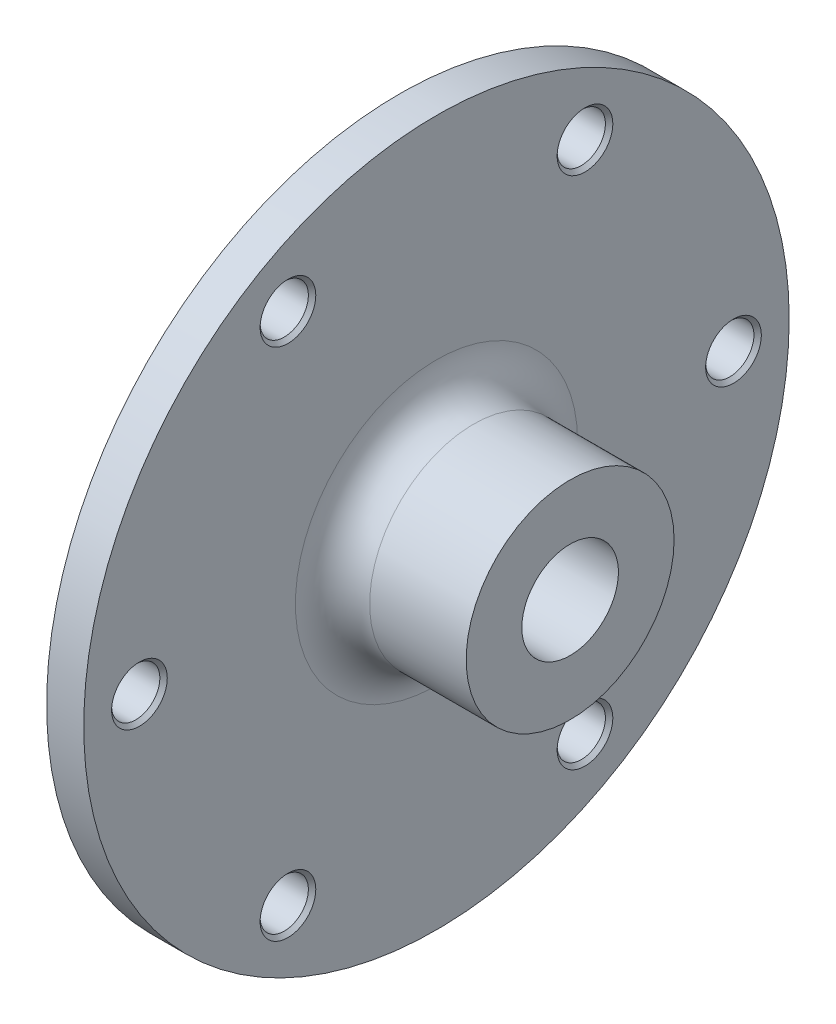
ISO-10303-21;
HEADER;
FILE_DESCRIPTION(('STEP AP214'),'2;1');
FILE_NAME('part.step','',(''),(''),'','','');
FILE_SCHEMA(('AUTOMOTIVE_DESIGN { 1 0 10303 214 1 1 1 1 }'));
ENDSEC;
DATA;
#1=APPLICATION_CONTEXT('core data for automotive mechanical design processes');
#2=APPLICATION_PROTOCOL_DEFINITION('international standard','automotive_design',2000,#1);
#3=PRODUCT_CONTEXT('',#1,'mechanical');
#4=PRODUCT('Part','Part','',(#3));
#5=PRODUCT_RELATED_PRODUCT_CATEGORY('part','',(#4));
#6=PRODUCT_DEFINITION_FORMATION('','',#4);
#7=PRODUCT_DEFINITION_CONTEXT('part definition',#1,'design');
#8=PRODUCT_DEFINITION('design','',#6,#7);
#9=PRODUCT_DEFINITION_SHAPE('','',#8);
#10=(LENGTH_UNIT() NAMED_UNIT(*) SI_UNIT(.MILLI.,.METRE.));
#11=(NAMED_UNIT(*) PLANE_ANGLE_UNIT() SI_UNIT($,.RADIAN.));
#12=(NAMED_UNIT(*) SI_UNIT($,.STERADIAN.) SOLID_ANGLE_UNIT());
#13=UNCERTAINTY_MEASURE_WITH_UNIT(LENGTH_MEASURE(1.E-05),#10,'distance_accuracy_value','');
#14=(GEOMETRIC_REPRESENTATION_CONTEXT(3) GLOBAL_UNCERTAINTY_ASSIGNED_CONTEXT((#13)) GLOBAL_UNIT_ASSIGNED_CONTEXT((#10,
#11,#12)) REPRESENTATION_CONTEXT('',''));
#15=CARTESIAN_POINT('',(0.,0.,0.));
#16=DIRECTION('',(0.,0.,1.));
#17=DIRECTION('',(1.,0.,0.));
#18=AXIS2_PLACEMENT_3D('',#15,#16,#17);
#19=CARTESIAN_POINT('',(0.,14.,0.));
#20=DIRECTION('',(1.,0.,0.));
#21=DIRECTION('',(0.,0.,-1.));
#22=AXIS2_PLACEMENT_3D('',#19,#20,#21);
#23=PLANE('',#22);
#24=CARTESIAN_POINT('',(0.,0.,0.));
#25=DIRECTION('',(-1.,0.,0.));
#26=DIRECTION('',(0.,0.,1.));
#27=AXIS2_PLACEMENT_3D('',#24,#25,#26);
#28=CIRCLE('',#27,6.49999999999999);
#29=CARTESIAN_POINT('',(0.,0.,6.49999999999999));
#30=VERTEX_POINT('',#29);
#31=EDGE_CURVE('E102',#30,#30,#28,.T.);
#32=ORIENTED_EDGE('',*,*,#31,.T.);
#33=EDGE_LOOP('',(#32));
#34=FACE_BOUND('',#33,.T.);
#35=CARTESIAN_POINT('',(0.,0.,0.));
#36=DIRECTION('',(1.,0.,0.));
#37=DIRECTION('',(0.,0.,-1.));
#38=AXIS2_PLACEMENT_3D('',#35,#36,#37);
#39=CIRCLE('',#38,14.);
#40=CARTESIAN_POINT('',(0.,0.,-14.));
#41=VERTEX_POINT('',#40);
#42=EDGE_CURVE('E105',#41,#41,#39,.T.);
#43=ORIENTED_EDGE('',*,*,#42,.T.);
#44=EDGE_LOOP('',(#43));
#45=FACE_BOUND('',#44,.T.);
#46=ADVANCED_FACE('F30',(#34,#45),#23,.T.);
#47=CARTESIAN_POINT('',(-28.,0.,0.));
#48=DIRECTION('',(-1.,0.,0.));
#49=DIRECTION('',(0.,0.,1.));
#50=AXIS2_PLACEMENT_3D('',#47,#48,#49);
#51=PLANE('',#50);
#52=CARTESIAN_POINT('',(-28.,0.,0.));
#53=DIRECTION('',(-1.,0.,0.));
#54=DIRECTION('',(0.,0.,1.));
#55=AXIS2_PLACEMENT_3D('',#52,#53,#54);
#56=CIRCLE('',#55,13.);
#57=CARTESIAN_POINT('',(-28.,0.,13.));
#58=VERTEX_POINT('',#57);
#59=EDGE_CURVE('E50',#58,#58,#56,.T.);
#60=ORIENTED_EDGE('',*,*,#59,.F.);
#61=EDGE_LOOP('',(#60));
#62=FACE_BOUND('',#61,.T.);
#63=CARTESIAN_POINT('',(-28.,0.,0.));
#64=DIRECTION('',(1.,0.,0.));
#65=DIRECTION('',(0.,0.,-1.));
#66=AXIS2_PLACEMENT_3D('',#63,#64,#65);
#67=CIRCLE('',#66,35.);
#68=CARTESIAN_POINT('',(-28.,0.,-35.));
#69=VERTEX_POINT('',#68);
#70=EDGE_CURVE('E43',#69,#69,#67,.T.);
#71=ORIENTED_EDGE('',*,*,#70,.F.);
#72=EDGE_LOOP('',(#71));
#73=FACE_BOUND('',#72,.T.);
#74=ADVANCED_FACE('F122',(#62,#73),#51,.T.);
#75=CARTESIAN_POINT('',(0.,0.,0.));
#76=DIRECTION('',(1.,0.,0.));
#77=DIRECTION('',(0.,0.,-1.));
#78=AXIS2_PLACEMENT_3D('',#75,#76,#77);
#79=CYLINDRICAL_SURFACE('',#78,35.);
#80=ORIENTED_EDGE('',*,*,#70,.T.);
#81=EDGE_LOOP('',(#80));
#82=FACE_BOUND('',#81,.T.);
#83=CARTESIAN_POINT('',(-23.,0.,0.));
#84=DIRECTION('',(1.,0.,0.));
#85=DIRECTION('',(0.,0.,-1.));
#86=AXIS2_PLACEMENT_3D('',#83,#84,#85);
#87=CIRCLE('',#86,35.);
#88=CARTESIAN_POINT('',(-23.,0.,-35.));
#89=VERTEX_POINT('',#88);
#90=EDGE_CURVE('E114',#89,#89,#87,.T.);
#91=ORIENTED_EDGE('',*,*,#90,.F.);
#92=EDGE_LOOP('',(#91));
#93=FACE_BOUND('',#92,.T.);
#94=ADVANCED_FACE('F119',(#82,#93),#79,.T.);
#95=CARTESIAN_POINT('',(-23.,35.,0.));
#96=DIRECTION('',(-1.,0.,0.));
#97=DIRECTION('',(0.,0.,1.));
#98=AXIS2_PLACEMENT_3D('',#95,#96,#97);
#99=PLANE('',#98);
#100=CARTESIAN_POINT('',(-23.,34.6410161513773,20.0000000000004));
#101=DIRECTION('',(-1.,0.,0.));
#102=DIRECTION('',(0.,0.,1.));
#103=AXIS2_PLACEMENT_3D('',#100,#101,#102);
#104=CIRCLE('',#103,3.25);
#105=CARTESIAN_POINT('',(-23.,34.6410161513773,23.2500000000004));
#106=VERTEX_POINT('',#105);
#107=EDGE_CURVE('E34',#106,#106,#104,.T.);
#108=ORIENTED_EDGE('',*,*,#107,.F.);
#109=EDGE_LOOP('',(#108));
#110=FACE_BOUND('',#109,.T.);
#111=CARTESIAN_POINT('',(-23.,34.6410161513777,-19.9999999999997));
#112=DIRECTION('',(-1.,0.,0.));
#113=DIRECTION('',(0.,0.,1.));
#114=AXIS2_PLACEMENT_3D('',#111,#112,#113);
#115=CIRCLE('',#114,3.25);
#116=CARTESIAN_POINT('',(-23.,34.6410161513777,-16.7499999999997));
#117=VERTEX_POINT('',#116);
#118=EDGE_CURVE('E66',#117,#117,#115,.T.);
#119=ORIENTED_EDGE('',*,*,#118,.F.);
#120=EDGE_LOOP('',(#119));
#121=FACE_BOUND('',#120,.T.);
#122=CARTESIAN_POINT('',(-23.,0.,-40.));
#123=DIRECTION('',(-1.,0.,0.));
#124=DIRECTION('',(0.,0.,1.));
#125=AXIS2_PLACEMENT_3D('',#122,#123,#124);
#126=CIRCLE('',#125,3.25);
#127=CARTESIAN_POINT('',(-23.,0.,-36.75));
#128=VERTEX_POINT('',#127);
#129=EDGE_CURVE('E62',#128,#128,#126,.T.);
#130=ORIENTED_EDGE('',*,*,#129,.F.);
#131=EDGE_LOOP('',(#130));
#132=FACE_BOUND('',#131,.T.);
#133=CARTESIAN_POINT('',(-23.,-34.6410161513775,-20.0000000000002));
#134=DIRECTION('',(-1.,0.,0.));
#135=DIRECTION('',(0.,0.,1.));
#136=AXIS2_PLACEMENT_3D('',#133,#134,#135);
#137=CIRCLE('',#136,3.25);
#138=CARTESIAN_POINT('',(-23.,-34.6410161513775,-16.7500000000002));
#139=VERTEX_POINT('',#138);
#140=EDGE_CURVE('E57',#139,#139,#137,.T.);
#141=ORIENTED_EDGE('',*,*,#140,.F.);
#142=EDGE_LOOP('',(#141));
#143=FACE_BOUND('',#142,.T.);
#144=CARTESIAN_POINT('',(-23.,-34.6410161513776,19.9999999999999));
#145=DIRECTION('',(-1.,0.,0.));
#146=DIRECTION('',(0.,0.,1.));
#147=AXIS2_PLACEMENT_3D('',#144,#145,#146);
#148=CIRCLE('',#147,3.25);
#149=CARTESIAN_POINT('',(-23.,-34.6410161513776,23.2499999999999));
#150=VERTEX_POINT('',#149);
#151=EDGE_CURVE('E52',#150,#150,#148,.T.);
#152=ORIENTED_EDGE('',*,*,#151,.F.);
#153=EDGE_LOOP('',(#152));
#154=FACE_BOUND('',#153,.T.);
#155=CARTESIAN_POINT('',(-23.,0.,40.));
#156=DIRECTION('',(-1.,0.,0.));
#157=DIRECTION('',(0.,0.,1.));
#158=AXIS2_PLACEMENT_3D('',#155,#156,#157);
#159=CIRCLE('',#158,3.25);
#160=CARTESIAN_POINT('',(-23.,0.,43.25));
#161=VERTEX_POINT('',#160);
#162=EDGE_CURVE('E47',#161,#161,#159,.T.);
#163=ORIENTED_EDGE('',*,*,#162,.F.);
#164=EDGE_LOOP('',(#163));
#165=FACE_BOUND('',#164,.T.);
#166=ORIENTED_EDGE('',*,*,#90,.T.);
#167=EDGE_LOOP('',(#166));
#168=FACE_BOUND('',#167,.T.);
#169=CARTESIAN_POINT('',(-23.,0.,0.));
#170=DIRECTION('',(1.,0.,0.));
#171=DIRECTION('',(0.,0.,-1.));
#172=AXIS2_PLACEMENT_3D('',#169,#170,#171);
#173=CIRCLE('',#172,47.5);
#174=CARTESIAN_POINT('',(-23.,0.,-47.5));
#175=VERTEX_POINT('',#174);
#176=EDGE_CURVE('E111',#175,#175,#173,.T.);
#177=ORIENTED_EDGE('',*,*,#176,.F.);
#178=EDGE_LOOP('',(#177));
#179=FACE_BOUND('',#178,.T.);
#180=ADVANCED_FACE('F130',(#110,#121,#132,#143,#154,#165,#168,#179),#99,.T.);
#181=CARTESIAN_POINT('',(0.,0.,0.));
#182=DIRECTION('',(1.,0.,0.));
#183=DIRECTION('',(0.,0.,-1.));
#184=AXIS2_PLACEMENT_3D('',#181,#182,#183);
#185=CYLINDRICAL_SURFACE('',#184,47.5);
#186=ORIENTED_EDGE('',*,*,#176,.T.);
#187=EDGE_LOOP('',(#186));
#188=FACE_BOUND('',#187,.T.);
#189=CARTESIAN_POINT('',(-18.,0.,0.));
#190=DIRECTION('',(1.,0.,0.));
#191=DIRECTION('',(0.,0.,-1.));
#192=AXIS2_PLACEMENT_3D('',#189,#190,#191);
#193=CIRCLE('',#192,47.5);
#194=CARTESIAN_POINT('',(-18.,0.,-47.5));
#195=VERTEX_POINT('',#194);
#196=EDGE_CURVE('E108',#195,#195,#193,.T.);
#197=ORIENTED_EDGE('',*,*,#196,.F.);
#198=EDGE_LOOP('',(#197));
#199=FACE_BOUND('',#198,.T.);
#200=ADVANCED_FACE('F137',(#188,#199),#185,.T.);
#201=CARTESIAN_POINT('',(-18.,47.5,0.));
#202=DIRECTION('',(1.,0.,0.));
#203=DIRECTION('',(0.,0.,-1.));
#204=AXIS2_PLACEMENT_3D('',#201,#202,#203);
#205=PLANE('',#204);
#206=CARTESIAN_POINT('',(-18.,34.6410161513773,20.0000000000004));
#207=DIRECTION('',(1.,0.,0.));
#208=DIRECTION('',(0.,0.,-1.));
#209=AXIS2_PLACEMENT_3D('',#206,#207,#208);
#210=CIRCLE('',#209,3.75);
#211=CARTESIAN_POINT('',(-18.,34.6410161513773,16.2500000000004));
#212=VERTEX_POINT('',#211);
#213=EDGE_CURVE('E212',#212,#212,#210,.T.);
#214=ORIENTED_EDGE('',*,*,#213,.F.);
#215=EDGE_LOOP('',(#214));
#216=FACE_BOUND('',#215,.T.);
#217=CARTESIAN_POINT('',(-18.,34.6410161513777,-19.9999999999997));
#218=DIRECTION('',(1.,0.,0.));
#219=DIRECTION('',(0.,0.,-1.));
#220=AXIS2_PLACEMENT_3D('',#217,#218,#219);
#221=CIRCLE('',#220,3.75);
#222=CARTESIAN_POINT('',(-18.,34.6410161513777,-23.7499999999997));
#223=VERTEX_POINT('',#222);
#224=EDGE_CURVE('E75',#223,#223,#221,.T.);
#225=ORIENTED_EDGE('',*,*,#224,.F.);
#226=EDGE_LOOP('',(#225));
#227=FACE_BOUND('',#226,.T.);
#228=CARTESIAN_POINT('',(-18.,0.,-40.));
#229=DIRECTION('',(1.,0.,0.));
#230=DIRECTION('',(0.,0.,-1.));
#231=AXIS2_PLACEMENT_3D('',#228,#229,#230);
#232=CIRCLE('',#231,3.75);
#233=CARTESIAN_POINT('',(-18.,0.,-43.75));
#234=VERTEX_POINT('',#233);
#235=EDGE_CURVE('E68',#234,#234,#232,.T.);
#236=ORIENTED_EDGE('',*,*,#235,.F.);
#237=EDGE_LOOP('',(#236));
#238=FACE_BOUND('',#237,.T.);
#239=CARTESIAN_POINT('',(-18.,-34.6410161513775,-20.0000000000002));
#240=DIRECTION('',(1.,0.,0.));
#241=DIRECTION('',(0.,0.,-1.));
#242=AXIS2_PLACEMENT_3D('',#239,#240,#241);
#243=CIRCLE('',#242,3.75);
#244=CARTESIAN_POINT('',(-18.,-34.6410161513775,-23.7500000000002));
#245=VERTEX_POINT('',#244);
#246=EDGE_CURVE('E64',#245,#245,#243,.T.);
#247=ORIENTED_EDGE('',*,*,#246,.F.);
#248=EDGE_LOOP('',(#247));
#249=FACE_BOUND('',#248,.T.);
#250=CARTESIAN_POINT('',(-18.,-34.6410161513776,19.9999999999999));
#251=DIRECTION('',(1.,0.,0.));
#252=DIRECTION('',(0.,0.,-1.));
#253=AXIS2_PLACEMENT_3D('',#250,#251,#252);
#254=CIRCLE('',#253,3.75);
#255=CARTESIAN_POINT('',(-18.,-34.6410161513776,16.2499999999999));
#256=VERTEX_POINT('',#255);
#257=EDGE_CURVE('E60',#256,#256,#254,.T.);
#258=ORIENTED_EDGE('',*,*,#257,.F.);
#259=EDGE_LOOP('',(#258));
#260=FACE_BOUND('',#259,.T.);
#261=CARTESIAN_POINT('',(-18.,0.,40.));
#262=DIRECTION('',(1.,0.,0.));
#263=DIRECTION('',(0.,0.,-1.));
#264=AXIS2_PLACEMENT_3D('',#261,#262,#263);
#265=CIRCLE('',#264,3.75);
#266=CARTESIAN_POINT('',(-18.,0.,36.25));
#267=VERTEX_POINT('',#266);
#268=EDGE_CURVE('E55',#267,#267,#265,.T.);
#269=ORIENTED_EDGE('',*,*,#268,.F.);
#270=EDGE_LOOP('',(#269));
#271=FACE_BOUND('',#270,.T.);
#272=CARTESIAN_POINT('',(-18.,0.,0.));
#273=DIRECTION('',(1.,0.,0.));
#274=DIRECTION('',(0.,0.,-1.));
#275=AXIS2_PLACEMENT_3D('',#272,#273,#274);
#276=CIRCLE('',#275,19.);
#277=CARTESIAN_POINT('',(-18.,0.,-19.));
#278=VERTEX_POINT('',#277);
#279=EDGE_CURVE('E10',#278,#278,#276,.F.);
#280=ORIENTED_EDGE('',*,*,#279,.T.);
#281=EDGE_LOOP('',(#280));
#282=FACE_BOUND('',#281,.T.);
#283=ORIENTED_EDGE('',*,*,#196,.T.);
#284=EDGE_LOOP('',(#283));
#285=FACE_BOUND('',#284,.T.);
#286=ADVANCED_FACE('F141',(#216,#227,#238,#249,#260,#271,#282,#285),#205,.T.);
#287=CARTESIAN_POINT('',(0.,0.,0.));
#288=DIRECTION('',(1.,0.,0.));
#289=DIRECTION('',(0.,0.,-1.));
#290=AXIS2_PLACEMENT_3D('',#287,#288,#289);
#291=CYLINDRICAL_SURFACE('',#290,14.);
#292=CARTESIAN_POINT('',(-13.,0.,0.));
#293=DIRECTION('',(1.,0.,0.));
#294=DIRECTION('',(0.,0.,-1.));
#295=AXIS2_PLACEMENT_3D('',#292,#293,#294);
#296=CIRCLE('',#295,14.);
#297=CARTESIAN_POINT('',(-13.,0.,-14.));
#298=VERTEX_POINT('',#297);
#299=EDGE_CURVE('E38',#298,#298,#296,.T.);
#300=ORIENTED_EDGE('',*,*,#299,.T.);
#301=EDGE_LOOP('',(#300));
#302=FACE_BOUND('',#301,.T.);
#303=ORIENTED_EDGE('',*,*,#42,.F.);
#304=EDGE_LOOP('',(#303));
#305=FACE_BOUND('',#304,.T.);
#306=ADVANCED_FACE('F145',(#302,#305),#291,.T.);
#307=CARTESIAN_POINT('',(-13.,0.,0.));
#308=DIRECTION('',(1.,0.,0.));
#309=DIRECTION('',(0.,0.,-1.));
#310=AXIS2_PLACEMENT_3D('',#307,#308,#309);
#311=TOROIDAL_SURFACE('',#310,19.,5.);
#312=ORIENTED_EDGE('',*,*,#279,.F.);
#313=EDGE_LOOP('',(#312));
#314=FACE_BOUND('',#313,.T.);
#315=ORIENTED_EDGE('',*,*,#299,.F.);
#316=EDGE_LOOP('',(#315));
#317=FACE_BOUND('',#316,.T.);
#318=ADVANCED_FACE('F32',(#314,#317),#311,.F.);
#319=CARTESIAN_POINT('',(-28.,0.,0.));
#320=DIRECTION('',(-1.,0.,0.));
#321=DIRECTION('',(0.,0.,1.));
#322=AXIS2_PLACEMENT_3D('',#319,#320,#321);
#323=CYLINDRICAL_SURFACE('',#322,6.49999999999999);
#324=ORIENTED_EDGE('',*,*,#31,.F.);
#325=EDGE_LOOP('',(#324));
#326=FACE_BOUND('',#325,.T.);
#327=CARTESIAN_POINT('',(-21.5,0.,0.));
#328=DIRECTION('',(-1.,0.,0.));
#329=DIRECTION('',(0.,0.,1.));
#330=AXIS2_PLACEMENT_3D('',#327,#328,#329);
#331=CIRCLE('',#330,6.49999999999999);
#332=CARTESIAN_POINT('',(-21.5,0.,6.49999999999999));
#333=VERTEX_POINT('',#332);
#334=EDGE_CURVE('E99',#333,#333,#331,.T.);
#335=ORIENTED_EDGE('',*,*,#334,.T.);
#336=EDGE_LOOP('',(#335));
#337=FACE_BOUND('',#336,.T.);
#338=ADVANCED_FACE('F150',(#326,#337),#323,.F.);
#339=CARTESIAN_POINT('',(-28.,0.,0.));
#340=DIRECTION('',(-1.,0.,0.));
#341=DIRECTION('',(0.,0.,1.));
#342=AXIS2_PLACEMENT_3D('',#339,#340,#341);
#343=CONICAL_SURFACE('',#342,13.,0.785398163397449);
#344=ORIENTED_EDGE('',*,*,#334,.F.);
#345=EDGE_LOOP('',(#344));
#346=FACE_BOUND('',#345,.T.);
#347=ORIENTED_EDGE('',*,*,#59,.T.);
#348=EDGE_LOOP('',(#347));
#349=FACE_BOUND('',#348,.T.);
#350=ADVANCED_FACE('F153',(#346,#349),#343,.F.);
#351=CARTESIAN_POINT('',(-18.,0.,40.));
#352=DIRECTION('',(1.,0.,0.));
#353=DIRECTION('',(0.,0.,-1.));
#354=AXIS2_PLACEMENT_3D('',#351,#352,#353);
#355=CYLINDRICAL_SURFACE('',#354,3.25);
#356=ORIENTED_EDGE('',*,*,#162,.T.);
#357=EDGE_LOOP('',(#356));
#358=FACE_BOUND('',#357,.T.);
#359=CARTESIAN_POINT('',(-18.5,0.,40.));
#360=DIRECTION('',(1.,0.,0.));
#361=DIRECTION('',(0.,0.,-1.));
#362=AXIS2_PLACEMENT_3D('',#359,#360,#361);
#363=CIRCLE('',#362,3.25);
#364=CARTESIAN_POINT('',(-18.5,0.,36.75));
#365=VERTEX_POINT('',#364);
#366=EDGE_CURVE('E51',#365,#365,#363,.T.);
#367=ORIENTED_EDGE('',*,*,#366,.T.);
#368=EDGE_LOOP('',(#367));
#369=FACE_BOUND('',#368,.T.);
#370=ADVANCED_FACE('F157',(#358,#369),#355,.F.);
#371=CARTESIAN_POINT('',(-18.,0.,40.));
#372=DIRECTION('',(1.,0.,0.));
#373=DIRECTION('',(0.,0.,-1.));
#374=AXIS2_PLACEMENT_3D('',#371,#372,#373);
#375=CONICAL_SURFACE('',#374,3.75,0.785398163397447);
#376=ORIENTED_EDGE('',*,*,#366,.F.);
#377=EDGE_LOOP('',(#376));
#378=FACE_BOUND('',#377,.T.);
#379=ORIENTED_EDGE('',*,*,#268,.T.);
#380=EDGE_LOOP('',(#379));
#381=FACE_BOUND('',#380,.T.);
#382=ADVANCED_FACE('F161',(#378,#381),#375,.F.);
#383=CARTESIAN_POINT('',(-18.,-34.6410161513776,19.9999999999999));
#384=DIRECTION('',(1.,0.,0.));
#385=DIRECTION('',(0.,0.,-1.));
#386=AXIS2_PLACEMENT_3D('',#383,#384,#385);
#387=CYLINDRICAL_SURFACE('',#386,3.25);
#388=ORIENTED_EDGE('',*,*,#151,.T.);
#389=EDGE_LOOP('',(#388));
#390=FACE_BOUND('',#389,.T.);
#391=CARTESIAN_POINT('',(-18.5,-34.6410161513776,19.9999999999999));
#392=DIRECTION('',(1.,0.,0.));
#393=DIRECTION('',(0.,0.,-1.));
#394=AXIS2_PLACEMENT_3D('',#391,#392,#393);
#395=CIRCLE('',#394,3.25);
#396=CARTESIAN_POINT('',(-18.5,-34.6410161513776,16.7499999999999));
#397=VERTEX_POINT('',#396);
#398=EDGE_CURVE('E56',#397,#397,#395,.T.);
#399=ORIENTED_EDGE('',*,*,#398,.T.);
#400=EDGE_LOOP('',(#399));
#401=FACE_BOUND('',#400,.T.);
#402=ADVANCED_FACE('F165',(#390,#401),#387,.F.);
#403=CARTESIAN_POINT('',(-18.,-34.6410161513776,19.9999999999999));
#404=DIRECTION('',(1.,0.,0.));
#405=DIRECTION('',(0.,0.,-1.));
#406=AXIS2_PLACEMENT_3D('',#403,#404,#405);
#407=CONICAL_SURFACE('',#406,3.75,0.785398163397448);
#408=ORIENTED_EDGE('',*,*,#398,.F.);
#409=EDGE_LOOP('',(#408));
#410=FACE_BOUND('',#409,.T.);
#411=ORIENTED_EDGE('',*,*,#257,.T.);
#412=EDGE_LOOP('',(#411));
#413=FACE_BOUND('',#412,.T.);
#414=ADVANCED_FACE('F169',(#410,#413),#407,.F.);
#415=CARTESIAN_POINT('',(-18.,-34.6410161513775,-20.0000000000002));
#416=DIRECTION('',(1.,0.,0.));
#417=DIRECTION('',(0.,0.,-1.));
#418=AXIS2_PLACEMENT_3D('',#415,#416,#417);
#419=CYLINDRICAL_SURFACE('',#418,3.25);
#420=ORIENTED_EDGE('',*,*,#140,.T.);
#421=EDGE_LOOP('',(#420));
#422=FACE_BOUND('',#421,.T.);
#423=CARTESIAN_POINT('',(-18.5,-34.6410161513775,-20.0000000000002));
#424=DIRECTION('',(1.,0.,0.));
#425=DIRECTION('',(0.,0.,-1.));
#426=AXIS2_PLACEMENT_3D('',#423,#424,#425);
#427=CIRCLE('',#426,3.25);
#428=CARTESIAN_POINT('',(-18.5,-34.6410161513775,-23.2500000000002));
#429=VERTEX_POINT('',#428);
#430=EDGE_CURVE('E61',#429,#429,#427,.T.);
#431=ORIENTED_EDGE('',*,*,#430,.T.);
#432=EDGE_LOOP('',(#431));
#433=FACE_BOUND('',#432,.T.);
#434=ADVANCED_FACE('F173',(#422,#433),#419,.F.);
#435=CARTESIAN_POINT('',(-18.,-34.6410161513775,-20.0000000000002));
#436=DIRECTION('',(1.,0.,0.));
#437=DIRECTION('',(0.,0.,-1.));
#438=AXIS2_PLACEMENT_3D('',#435,#436,#437);
#439=CONICAL_SURFACE('',#438,3.75,0.785398163397448);
#440=ORIENTED_EDGE('',*,*,#430,.F.);
#441=EDGE_LOOP('',(#440));
#442=FACE_BOUND('',#441,.T.);
#443=ORIENTED_EDGE('',*,*,#246,.T.);
#444=EDGE_LOOP('',(#443));
#445=FACE_BOUND('',#444,.T.);
#446=ADVANCED_FACE('F177',(#442,#445),#439,.F.);
#447=CARTESIAN_POINT('',(-18.,0.,-40.));
#448=DIRECTION('',(1.,0.,0.));
#449=DIRECTION('',(0.,0.,-1.));
#450=AXIS2_PLACEMENT_3D('',#447,#448,#449);
#451=CYLINDRICAL_SURFACE('',#450,3.25);
#452=ORIENTED_EDGE('',*,*,#129,.T.);
#453=EDGE_LOOP('',(#452));
#454=FACE_BOUND('',#453,.T.);
#455=CARTESIAN_POINT('',(-18.5,0.,-40.));
#456=DIRECTION('',(1.,0.,0.));
#457=DIRECTION('',(0.,0.,-1.));
#458=AXIS2_PLACEMENT_3D('',#455,#456,#457);
#459=CIRCLE('',#458,3.25);
#460=CARTESIAN_POINT('',(-18.5,0.,-43.25));
#461=VERTEX_POINT('',#460);
#462=EDGE_CURVE('E65',#461,#461,#459,.T.);
#463=ORIENTED_EDGE('',*,*,#462,.T.);
#464=EDGE_LOOP('',(#463));
#465=FACE_BOUND('',#464,.T.);
#466=ADVANCED_FACE('F181',(#454,#465),#451,.F.);
#467=CARTESIAN_POINT('',(-18.,0.,-40.));
#468=DIRECTION('',(1.,0.,0.));
#469=DIRECTION('',(0.,0.,-1.));
#470=AXIS2_PLACEMENT_3D('',#467,#468,#469);
#471=CONICAL_SURFACE('',#470,3.75,0.785398163397447);
#472=ORIENTED_EDGE('',*,*,#462,.F.);
#473=EDGE_LOOP('',(#472));
#474=FACE_BOUND('',#473,.T.);
#475=ORIENTED_EDGE('',*,*,#235,.T.);
#476=EDGE_LOOP('',(#475));
#477=FACE_BOUND('',#476,.T.);
#478=ADVANCED_FACE('F185',(#474,#477),#471,.F.);
#479=CARTESIAN_POINT('',(-18.,34.6410161513777,-19.9999999999997));
#480=DIRECTION('',(1.,0.,0.));
#481=DIRECTION('',(0.,0.,-1.));
#482=AXIS2_PLACEMENT_3D('',#479,#480,#481);
#483=CYLINDRICAL_SURFACE('',#482,3.25);
#484=ORIENTED_EDGE('',*,*,#118,.T.);
#485=EDGE_LOOP('',(#484));
#486=FACE_BOUND('',#485,.T.);
#487=CARTESIAN_POINT('',(-18.5,34.6410161513777,-19.9999999999997));
#488=DIRECTION('',(1.,0.,0.));
#489=DIRECTION('',(0.,0.,-1.));
#490=AXIS2_PLACEMENT_3D('',#487,#488,#489);
#491=CIRCLE('',#490,3.25);
#492=CARTESIAN_POINT('',(-18.5,34.6410161513777,-23.2499999999997));
#493=VERTEX_POINT('',#492);
#494=EDGE_CURVE('E69',#493,#493,#491,.T.);
#495=ORIENTED_EDGE('',*,*,#494,.T.);
#496=EDGE_LOOP('',(#495));
#497=FACE_BOUND('',#496,.T.);
#498=ADVANCED_FACE('F189',(#486,#497),#483,.F.);
#499=CARTESIAN_POINT('',(-18.,34.6410161513777,-19.9999999999997));
#500=DIRECTION('',(1.,0.,0.));
#501=DIRECTION('',(0.,0.,-1.));
#502=AXIS2_PLACEMENT_3D('',#499,#500,#501);
#503=CONICAL_SURFACE('',#502,3.75,0.785398163397445);
#504=ORIENTED_EDGE('',*,*,#494,.F.);
#505=EDGE_LOOP('',(#504));
#506=FACE_BOUND('',#505,.T.);
#507=ORIENTED_EDGE('',*,*,#224,.T.);
#508=EDGE_LOOP('',(#507));
#509=FACE_BOUND('',#508,.T.);
#510=ADVANCED_FACE('F193',(#506,#509),#503,.F.);
#511=CARTESIAN_POINT('',(-18.,34.6410161513773,20.0000000000004));
#512=DIRECTION('',(1.,0.,0.));
#513=DIRECTION('',(0.,0.,-1.));
#514=AXIS2_PLACEMENT_3D('',#511,#512,#513);
#515=CYLINDRICAL_SURFACE('',#514,3.25);
#516=ORIENTED_EDGE('',*,*,#107,.T.);
#517=EDGE_LOOP('',(#516));
#518=FACE_BOUND('',#517,.T.);
#519=CARTESIAN_POINT('',(-18.5,34.6410161513773,20.0000000000004));
#520=DIRECTION('',(1.,0.,0.));
#521=DIRECTION('',(0.,0.,-1.));
#522=AXIS2_PLACEMENT_3D('',#519,#520,#521);
#523=CIRCLE('',#522,3.25);
#524=CARTESIAN_POINT('',(-18.5,34.6410161513773,16.7500000000004));
#525=VERTEX_POINT('',#524);
#526=EDGE_CURVE('E209',#525,#525,#523,.T.);
#527=ORIENTED_EDGE('',*,*,#526,.T.);
#528=EDGE_LOOP('',(#527));
#529=FACE_BOUND('',#528,.T.);
#530=ADVANCED_FACE('F196',(#518,#529),#515,.F.);
#531=CARTESIAN_POINT('',(-18.,34.6410161513773,20.0000000000004));
#532=DIRECTION('',(1.,0.,0.));
#533=DIRECTION('',(0.,0.,-1.));
#534=AXIS2_PLACEMENT_3D('',#531,#532,#533);
#535=CONICAL_SURFACE('',#534,3.75,0.785398163397445);
#536=ORIENTED_EDGE('',*,*,#526,.F.);
#537=EDGE_LOOP('',(#536));
#538=FACE_BOUND('',#537,.T.);
#539=ORIENTED_EDGE('',*,*,#213,.T.);
#540=EDGE_LOOP('',(#539));
#541=FACE_BOUND('',#540,.T.);
#542=ADVANCED_FACE('F200',(#538,#541),#535,.F.);
#543=CLOSED_SHELL('',(#46,#74,#94,#180,#200,#286,#306,#318,#338,#350,#370,#382,#402,#414,#434,
#446,#466,#478,#498,#510,#530,#542));
#544=MANIFOLD_SOLID_BREP('B2',#543);
#545=ADVANCED_BREP_SHAPE_REPRESENTATION('',(#18,#544),#14);
#546=SHAPE_DEFINITION_REPRESENTATION(#9,#545);
ENDSEC;
END-ISO-10303-21;
